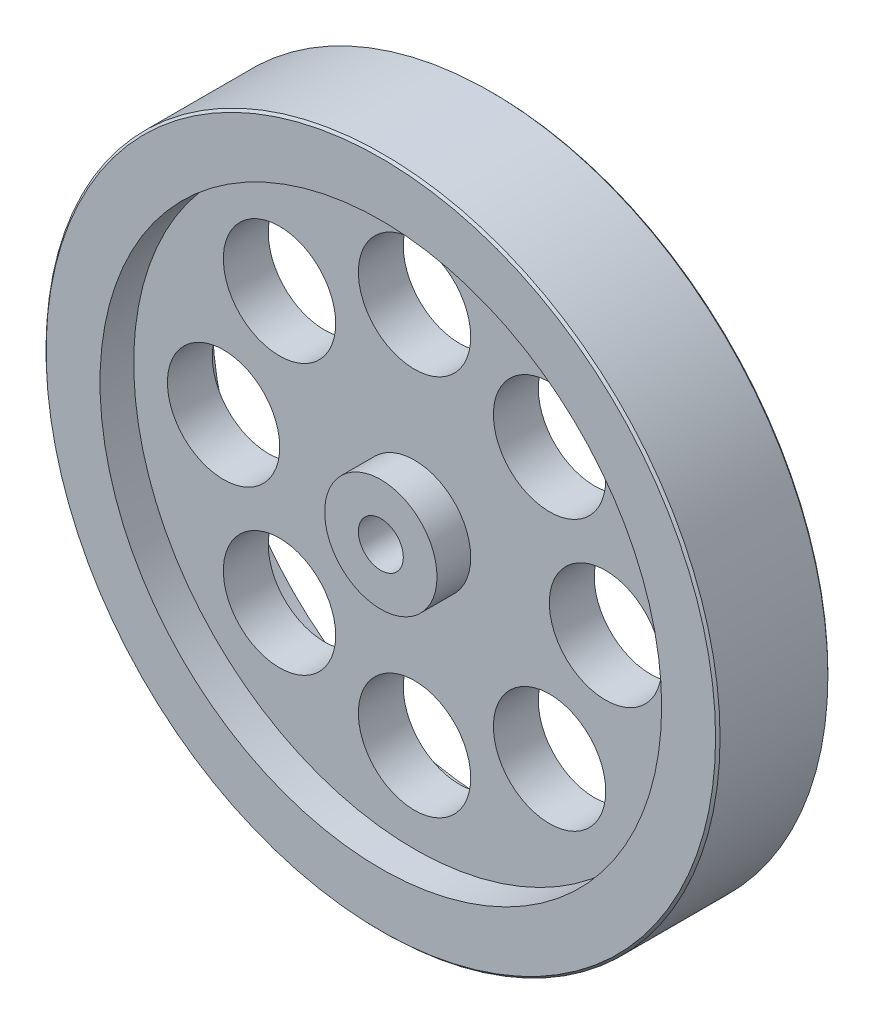
ISO-10303-21;
HEADER;
FILE_DESCRIPTION(('STEP AP214'),'2;1');
FILE_NAME('part.step','',(''),(''),'','','');
FILE_SCHEMA(('AUTOMOTIVE_DESIGN { 1 0 10303 214 1 1 1 1 }'));
ENDSEC;
DATA;
#1=APPLICATION_CONTEXT('core data for automotive mechanical design processes');
#2=APPLICATION_PROTOCOL_DEFINITION('international standard','automotive_design',2000,#1);
#3=PRODUCT_CONTEXT('',#1,'mechanical');
#4=PRODUCT('Part','Part','',(#3));
#5=PRODUCT_RELATED_PRODUCT_CATEGORY('part','',(#4));
#6=PRODUCT_DEFINITION_FORMATION('','',#4);
#7=PRODUCT_DEFINITION_CONTEXT('part definition',#1,'design');
#8=PRODUCT_DEFINITION('design','',#6,#7);
#9=PRODUCT_DEFINITION_SHAPE('','',#8);
#10=(LENGTH_UNIT() NAMED_UNIT(*) SI_UNIT(.MILLI.,.METRE.));
#11=(NAMED_UNIT(*) PLANE_ANGLE_UNIT() SI_UNIT($,.RADIAN.));
#12=(NAMED_UNIT(*) SI_UNIT($,.STERADIAN.) SOLID_ANGLE_UNIT());
#13=UNCERTAINTY_MEASURE_WITH_UNIT(LENGTH_MEASURE(1.E-05),#10,'distance_accuracy_value','');
#14=(GEOMETRIC_REPRESENTATION_CONTEXT(3) GLOBAL_UNCERTAINTY_ASSIGNED_CONTEXT((#13)) GLOBAL_UNIT_ASSIGNED_CONTEXT((#10,
#11,#12)) REPRESENTATION_CONTEXT('',''));
#15=CARTESIAN_POINT('',(0.,0.,0.));
#16=DIRECTION('',(0.,0.,1.));
#17=DIRECTION('',(1.,0.,0.));
#18=AXIS2_PLACEMENT_3D('',#15,#16,#17);
#19=CARTESIAN_POINT('',(0.,0.,5.));
#20=DIRECTION('',(0.,0.,-1.));
#21=DIRECTION('',(-1.,0.,0.));
#22=AXIS2_PLACEMENT_3D('',#19,#20,#21);
#23=CYLINDRICAL_SURFACE('',#22,30.);
#24=CARTESIAN_POINT('',(0.,0.,4.80000000000003));
#25=DIRECTION('',(0.,0.,1.));
#26=DIRECTION('',(1.,0.,0.));
#27=AXIS2_PLACEMENT_3D('',#24,#25,#26);
#28=CIRCLE('',#27,30.);
#29=CARTESIAN_POINT('',(30.,0.,4.80000000000003));
#30=VERTEX_POINT('',#29);
#31=EDGE_CURVE('E43',#30,#30,#28,.F.);
#32=ORIENTED_EDGE('',*,*,#31,.T.);
#33=EDGE_LOOP('',(#32));
#34=FACE_BOUND('',#33,.T.);
#35=CARTESIAN_POINT('',(0.,0.,-4.80000000000001));
#36=DIRECTION('',(0.,0.,1.));
#37=DIRECTION('',(1.,0.,0.));
#38=AXIS2_PLACEMENT_3D('',#35,#36,#37);
#39=CIRCLE('',#38,30.);
#40=CARTESIAN_POINT('',(30.,0.,-4.80000000000001));
#41=VERTEX_POINT('',#40);
#42=EDGE_CURVE('E47',#41,#41,#39,.T.);
#43=ORIENTED_EDGE('',*,*,#42,.T.);
#44=EDGE_LOOP('',(#43));
#45=FACE_BOUND('',#44,.T.);
#46=ADVANCED_FACE('F35',(#34,#45),#23,.T.);
#47=CARTESIAN_POINT('',(0.,0.,5.));
#48=DIRECTION('',(0.,0.,1.));
#49=DIRECTION('',(1.,0.,0.));
#50=AXIS2_PLACEMENT_3D('',#47,#48,#49);
#51=PLANE('',#50);
#52=CARTESIAN_POINT('',(0.,0.,5.));
#53=DIRECTION('',(0.,0.,1.));
#54=DIRECTION('',(1.,0.,0.));
#55=AXIS2_PLACEMENT_3D('',#52,#53,#54);
#56=CIRCLE('',#55,29.8);
#57=CARTESIAN_POINT('',(29.8,0.,5.));
#58=VERTEX_POINT('',#57);
#59=EDGE_CURVE('E51',#58,#58,#56,.T.);
#60=ORIENTED_EDGE('',*,*,#59,.T.);
#61=EDGE_LOOP('',(#60));
#62=FACE_BOUND('',#61,.T.);
#63=CARTESIAN_POINT('',(0.,0.,5.));
#64=DIRECTION('',(0.,0.,1.));
#65=DIRECTION('',(1.,0.,0.));
#66=AXIS2_PLACEMENT_3D('',#63,#64,#65);
#67=CIRCLE('',#66,25.);
#68=CARTESIAN_POINT('',(25.,0.,5.));
#69=VERTEX_POINT('',#68);
#70=EDGE_CURVE('E93',#69,#69,#67,.T.);
#71=ORIENTED_EDGE('',*,*,#70,.F.);
#72=EDGE_LOOP('',(#71));
#73=FACE_BOUND('',#72,.T.);
#74=ADVANCED_FACE('F191',(#62,#73),#51,.T.);
#75=CARTESIAN_POINT('',(0.,0.,-5.));
#76=DIRECTION('',(0.,0.,1.));
#77=DIRECTION('',(1.,0.,0.));
#78=AXIS2_PLACEMENT_3D('',#75,#76,#77);
#79=PLANE('',#78);
#80=CARTESIAN_POINT('',(0.,0.,-5.));
#81=DIRECTION('',(0.,0.,1.));
#82=DIRECTION('',(1.,0.,0.));
#83=AXIS2_PLACEMENT_3D('',#80,#81,#82);
#84=CIRCLE('',#83,29.8);
#85=CARTESIAN_POINT('',(29.8,0.,-5.));
#86=VERTEX_POINT('',#85);
#87=EDGE_CURVE('E10',#86,#86,#84,.F.);
#88=ORIENTED_EDGE('',*,*,#87,.T.);
#89=EDGE_LOOP('',(#88));
#90=FACE_BOUND('',#89,.T.);
#91=CARTESIAN_POINT('',(0.,0.,-5.));
#92=DIRECTION('',(0.,0.,1.));
#93=DIRECTION('',(1.,0.,0.));
#94=AXIS2_PLACEMENT_3D('',#91,#92,#93);
#95=CIRCLE('',#94,25.);
#96=CARTESIAN_POINT('',(25.,0.,-5.));
#97=VERTEX_POINT('',#96);
#98=EDGE_CURVE('E99',#97,#97,#95,.T.);
#99=ORIENTED_EDGE('',*,*,#98,.T.);
#100=EDGE_LOOP('',(#99));
#101=FACE_BOUND('',#100,.T.);
#102=ADVANCED_FACE('F187',(#90,#101),#79,.F.);
#103=CARTESIAN_POINT('',(0.,0.,2.));
#104=DIRECTION('',(0.,0.,1.));
#105=DIRECTION('',(1.,0.,0.));
#106=AXIS2_PLACEMENT_3D('',#103,#104,#105);
#107=CYLINDRICAL_SURFACE('',#106,25.);
#108=CARTESIAN_POINT('',(0.,0.,2.));
#109=DIRECTION('',(0.,0.,1.));
#110=DIRECTION('',(1.,0.,0.));
#111=AXIS2_PLACEMENT_3D('',#108,#109,#110);
#112=CIRCLE('',#111,25.);
#113=CARTESIAN_POINT('',(25.,0.,2.));
#114=VERTEX_POINT('',#113);
#115=EDGE_CURVE('E59',#114,#114,#112,.T.);
#116=ORIENTED_EDGE('',*,*,#115,.F.);
#117=EDGE_LOOP('',(#116));
#118=FACE_BOUND('',#117,.T.);
#119=ORIENTED_EDGE('',*,*,#70,.T.);
#120=EDGE_LOOP('',(#119));
#121=FACE_BOUND('',#120,.T.);
#122=ADVANCED_FACE('F165',(#118,#121),#107,.F.);
#123=CARTESIAN_POINT('',(0.,0.,2.));
#124=DIRECTION('',(0.,0.,1.));
#125=DIRECTION('',(1.,0.,0.));
#126=AXIS2_PLACEMENT_3D('',#123,#124,#125);
#127=PLANE('',#126);
#128=CARTESIAN_POINT('',(0.,0.,2.));
#129=DIRECTION('',(0.,0.,1.));
#130=DIRECTION('',(1.,0.,0.));
#131=AXIS2_PLACEMENT_3D('',#128,#129,#130);
#132=CIRCLE('',#131,5.);
#133=CARTESIAN_POINT('',(5.,0.,2.));
#134=VERTEX_POINT('',#133);
#135=EDGE_CURVE('E120',#134,#134,#132,.T.);
#136=ORIENTED_EDGE('',*,*,#135,.F.);
#137=EDGE_LOOP('',(#136));
#138=FACE_BOUND('',#137,.T.);
#139=CARTESIAN_POINT('',(-12.0208152801711,12.0208152801708,2.));
#140=DIRECTION('',(0.,0.,1.));
#141=DIRECTION('',(1.,0.,0.));
#142=AXIS2_PLACEMENT_3D('',#139,#140,#141);
#143=CIRCLE('',#142,5.00000000000056);
#144=CARTESIAN_POINT('',(-7.02081528017055,12.0208152801708,2.));
#145=VERTEX_POINT('',#144);
#146=EDGE_CURVE('E63',#145,#145,#143,.T.);
#147=ORIENTED_EDGE('',*,*,#146,.F.);
#148=EDGE_LOOP('',(#147));
#149=FACE_BOUND('',#148,.T.);
#150=CARTESIAN_POINT('',(-16.9999999999993,-7.23712640696027E-13,2.));
#151=DIRECTION('',(0.,0.,1.));
#152=DIRECTION('',(1.,0.,0.));
#153=AXIS2_PLACEMENT_3D('',#150,#151,#152);
#154=CIRCLE('',#153,5.00000000000107);
#155=CARTESIAN_POINT('',(-11.9999999999982,-7.23712640696027E-13,2.));
#156=VERTEX_POINT('',#155);
#157=EDGE_CURVE('E64',#156,#156,#154,.T.);
#158=ORIENTED_EDGE('',*,*,#157,.F.);
#159=EDGE_LOOP('',(#158));
#160=FACE_BOUND('',#159,.T.);
#161=CARTESIAN_POINT('',(-12.0208152801701,-12.0208152801718,2.));
#162=DIRECTION('',(0.,0.,1.));
#163=DIRECTION('',(1.,0.,0.));
#164=AXIS2_PLACEMENT_3D('',#161,#162,#163);
#165=CIRCLE('',#164,5.00000000000147);
#166=CARTESIAN_POINT('',(-7.02081528016861,-12.0208152801718,2.));
#167=VERTEX_POINT('',#166);
#168=EDGE_CURVE('E68',#167,#167,#165,.T.);
#169=ORIENTED_EDGE('',*,*,#168,.F.);
#170=EDGE_LOOP('',(#169));
#171=FACE_BOUND('',#170,.T.);
#172=CARTESIAN_POINT('',(1.44326148227495E-12,-17.,2.));
#173=DIRECTION('',(0.,0.,1.));
#174=DIRECTION('',(1.,0.,0.));
#175=AXIS2_PLACEMENT_3D('',#172,#173,#174);
#176=CIRCLE('',#175,5.0000000000015);
#177=CARTESIAN_POINT('',(5.00000000000294,-17.,2.));
#178=VERTEX_POINT('',#177);
#179=EDGE_CURVE('E72',#178,#178,#176,.T.);
#180=ORIENTED_EDGE('',*,*,#179,.F.);
#181=EDGE_LOOP('',(#180));
#182=FACE_BOUND('',#181,.T.);
#183=CARTESIAN_POINT('',(12.0208152801725,-12.0208152801708,2.));
#184=DIRECTION('',(0.,0.,1.));
#185=DIRECTION('',(1.,0.,0.));
#186=AXIS2_PLACEMENT_3D('',#183,#184,#185);
#187=CIRCLE('',#186,5.00000000000111);
#188=CARTESIAN_POINT('',(17.0208152801737,-12.0208152801708,2.));
#189=VERTEX_POINT('',#188);
#190=EDGE_CURVE('E76',#189,#189,#187,.T.);
#191=ORIENTED_EDGE('',*,*,#190,.F.);
#192=EDGE_LOOP('',(#191));
#193=FACE_BOUND('',#192,.T.);
#194=CARTESIAN_POINT('',(17.0000000000007,7.21630741137477E-13,2.));
#195=DIRECTION('',(0.,0.,1.));
#196=DIRECTION('',(1.,0.,0.));
#197=AXIS2_PLACEMENT_3D('',#194,#195,#196);
#198=CIRCLE('',#197,5.00000000000054);
#199=CARTESIAN_POINT('',(22.0000000000013,7.21630741137477E-13,2.));
#200=VERTEX_POINT('',#199);
#201=EDGE_CURVE('E80',#200,#200,#198,.T.);
#202=ORIENTED_EDGE('',*,*,#201,.F.);
#203=EDGE_LOOP('',(#202));
#204=FACE_BOUND('',#203,.T.);
#205=CARTESIAN_POINT('',(12.0208152801715,12.0208152801718,2.));
#206=DIRECTION('',(0.,0.,1.));
#207=DIRECTION('',(1.,0.,0.));
#208=AXIS2_PLACEMENT_3D('',#205,#206,#207);
#209=CIRCLE('',#208,5.00000000000009);
#210=CARTESIAN_POINT('',(17.0208152801716,12.0208152801718,2.));
#211=VERTEX_POINT('',#210);
#212=EDGE_CURVE('E84',#211,#211,#209,.T.);
#213=ORIENTED_EDGE('',*,*,#212,.F.);
#214=EDGE_LOOP('',(#213));
#215=FACE_BOUND('',#214,.T.);
#216=CARTESIAN_POINT('',(0.,17.,2.));
#217=DIRECTION('',(0.,0.,1.));
#218=DIRECTION('',(1.,0.,0.));
#219=AXIS2_PLACEMENT_3D('',#216,#217,#218);
#220=CIRCLE('',#219,5.);
#221=CARTESIAN_POINT('',(5.,17.,2.));
#222=VERTEX_POINT('',#221);
#223=EDGE_CURVE('E88',#222,#222,#220,.T.);
#224=ORIENTED_EDGE('',*,*,#223,.F.);
#225=EDGE_LOOP('',(#224));
#226=FACE_BOUND('',#225,.T.);
#227=ORIENTED_EDGE('',*,*,#115,.T.);
#228=EDGE_LOOP('',(#227));
#229=FACE_BOUND('',#228,.T.);
#230=ADVANCED_FACE('F161',(#138,#149,#160,#171,#182,#193,#204,#215,#226,#229),#127,.T.);
#231=CARTESIAN_POINT('',(0.,0.,-2.));
#232=DIRECTION('',(0.,0.,-1.));
#233=DIRECTION('',(-1.,0.,0.));
#234=AXIS2_PLACEMENT_3D('',#231,#232,#233);
#235=CYLINDRICAL_SURFACE('',#234,25.);
#236=CARTESIAN_POINT('',(0.,0.,-2.));
#237=DIRECTION('',(0.,0.,1.));
#238=DIRECTION('',(1.,0.,0.));
#239=AXIS2_PLACEMENT_3D('',#236,#237,#238);
#240=CIRCLE('',#239,25.);
#241=CARTESIAN_POINT('',(25.,0.,-2.));
#242=VERTEX_POINT('',#241);
#243=EDGE_CURVE('E96',#242,#242,#240,.T.);
#244=ORIENTED_EDGE('',*,*,#243,.T.);
#245=EDGE_LOOP('',(#244));
#246=FACE_BOUND('',#245,.T.);
#247=ORIENTED_EDGE('',*,*,#98,.F.);
#248=EDGE_LOOP('',(#247));
#249=FACE_BOUND('',#248,.T.);
#250=ADVANCED_FACE('F164',(#246,#249),#235,.F.);
#251=CARTESIAN_POINT('',(0.,0.,-2.));
#252=DIRECTION('',(0.,0.,-1.));
#253=DIRECTION('',(1.,0.,0.));
#254=AXIS2_PLACEMENT_3D('',#251,#252,#253);
#255=PLANE('',#254);
#256=CARTESIAN_POINT('',(0.,0.,-2.));
#257=DIRECTION('',(0.,0.,-1.));
#258=DIRECTION('',(-1.,0.,0.));
#259=AXIS2_PLACEMENT_3D('',#256,#257,#258);
#260=CIRCLE('',#259,5.);
#261=CARTESIAN_POINT('',(-5.,0.,-2.));
#262=VERTEX_POINT('',#261);
#263=EDGE_CURVE('E56',#262,#262,#260,.T.);
#264=ORIENTED_EDGE('',*,*,#263,.F.);
#265=EDGE_LOOP('',(#264));
#266=FACE_BOUND('',#265,.T.);
#267=CARTESIAN_POINT('',(-12.0208152801711,12.0208152801708,-2.));
#268=DIRECTION('',(0.,0.,-1.));
#269=DIRECTION('',(-1.,0.,0.));
#270=AXIS2_PLACEMENT_3D('',#267,#268,#269);
#271=CIRCLE('',#270,5.00000000000056);
#272=CARTESIAN_POINT('',(-17.0208152801717,12.0208152801708,-2.));
#273=VERTEX_POINT('',#272);
#274=EDGE_CURVE('E60',#273,#273,#271,.T.);
#275=ORIENTED_EDGE('',*,*,#274,.F.);
#276=EDGE_LOOP('',(#275));
#277=FACE_BOUND('',#276,.T.);
#278=CARTESIAN_POINT('',(-16.9999999999993,-7.23712640696027E-13,-2.));
#279=DIRECTION('',(0.,0.,-1.));
#280=DIRECTION('',(-1.,0.,0.));
#281=AXIS2_PLACEMENT_3D('',#278,#279,#280);
#282=CIRCLE('',#281,5.00000000000107);
#283=CARTESIAN_POINT('',(-22.0000000000004,-7.23712640696027E-13,-2.));
#284=VERTEX_POINT('',#283);
#285=EDGE_CURVE('E65',#284,#284,#282,.T.);
#286=ORIENTED_EDGE('',*,*,#285,.F.);
#287=EDGE_LOOP('',(#286));
#288=FACE_BOUND('',#287,.T.);
#289=CARTESIAN_POINT('',(-12.0208152801701,-12.0208152801718,-2.));
#290=DIRECTION('',(0.,0.,-1.));
#291=DIRECTION('',(-1.,0.,0.));
#292=AXIS2_PLACEMENT_3D('',#289,#290,#291);
#293=CIRCLE('',#292,5.00000000000147);
#294=CARTESIAN_POINT('',(-17.0208152801715,-12.0208152801718,-2.));
#295=VERTEX_POINT('',#294);
#296=EDGE_CURVE('E69',#295,#295,#293,.T.);
#297=ORIENTED_EDGE('',*,*,#296,.F.);
#298=EDGE_LOOP('',(#297));
#299=FACE_BOUND('',#298,.T.);
#300=CARTESIAN_POINT('',(1.44326148227495E-12,-17.,-2.));
#301=DIRECTION('',(0.,0.,-1.));
#302=DIRECTION('',(-1.,0.,0.));
#303=AXIS2_PLACEMENT_3D('',#300,#301,#302);
#304=CIRCLE('',#303,5.0000000000015);
#305=CARTESIAN_POINT('',(-5.00000000000005,-17.,-2.));
#306=VERTEX_POINT('',#305);
#307=EDGE_CURVE('E73',#306,#306,#304,.T.);
#308=ORIENTED_EDGE('',*,*,#307,.F.);
#309=EDGE_LOOP('',(#308));
#310=FACE_BOUND('',#309,.T.);
#311=CARTESIAN_POINT('',(12.0208152801725,-12.0208152801708,-2.));
#312=DIRECTION('',(0.,0.,-1.));
#313=DIRECTION('',(-1.,0.,0.));
#314=AXIS2_PLACEMENT_3D('',#311,#312,#313);
#315=CIRCLE('',#314,5.00000000000111);
#316=CARTESIAN_POINT('',(7.02081528017143,-12.0208152801708,-2.));
#317=VERTEX_POINT('',#316);
#318=EDGE_CURVE('E77',#317,#317,#315,.T.);
#319=ORIENTED_EDGE('',*,*,#318,.F.);
#320=EDGE_LOOP('',(#319));
#321=FACE_BOUND('',#320,.T.);
#322=CARTESIAN_POINT('',(17.0000000000007,7.21630741137477E-13,-2.));
#323=DIRECTION('',(0.,0.,-1.));
#324=DIRECTION('',(-1.,0.,0.));
#325=AXIS2_PLACEMENT_3D('',#322,#323,#324);
#326=CIRCLE('',#325,5.00000000000054);
#327=CARTESIAN_POINT('',(12.0000000000002,7.21630741137477E-13,-2.));
#328=VERTEX_POINT('',#327);
#329=EDGE_CURVE('E81',#328,#328,#326,.T.);
#330=ORIENTED_EDGE('',*,*,#329,.F.);
#331=EDGE_LOOP('',(#330));
#332=FACE_BOUND('',#331,.T.);
#333=CARTESIAN_POINT('',(12.0208152801715,12.0208152801718,-2.));
#334=DIRECTION('',(0.,0.,-1.));
#335=DIRECTION('',(-1.,0.,0.));
#336=AXIS2_PLACEMENT_3D('',#333,#334,#335);
#337=CIRCLE('',#336,5.00000000000009);
#338=CARTESIAN_POINT('',(7.02081528017143,12.0208152801718,-2.));
#339=VERTEX_POINT('',#338);
#340=EDGE_CURVE('E85',#339,#339,#337,.T.);
#341=ORIENTED_EDGE('',*,*,#340,.F.);
#342=EDGE_LOOP('',(#341));
#343=FACE_BOUND('',#342,.T.);
#344=CARTESIAN_POINT('',(0.,17.,-2.));
#345=DIRECTION('',(0.,0.,-1.));
#346=DIRECTION('',(-1.,0.,0.));
#347=AXIS2_PLACEMENT_3D('',#344,#345,#346);
#348=CIRCLE('',#347,5.);
#349=CARTESIAN_POINT('',(-5.,17.,-2.));
#350=VERTEX_POINT('',#349);
#351=EDGE_CURVE('E89',#350,#350,#348,.T.);
#352=ORIENTED_EDGE('',*,*,#351,.F.);
#353=EDGE_LOOP('',(#352));
#354=FACE_BOUND('',#353,.T.);
#355=ORIENTED_EDGE('',*,*,#243,.F.);
#356=EDGE_LOOP('',(#355));
#357=FACE_BOUND('',#356,.T.);
#358=ADVANCED_FACE('F267',(#266,#277,#288,#299,#310,#321,#332,#343,#354,#357),#255,.T.);
#359=CARTESIAN_POINT('',(0.,17.,-5.));
#360=DIRECTION('',(0.,0.,1.));
#361=DIRECTION('',(1.,0.,0.));
#362=AXIS2_PLACEMENT_3D('',#359,#360,#361);
#363=CYLINDRICAL_SURFACE('',#362,5.);
#364=ORIENTED_EDGE('',*,*,#223,.T.);
#365=EDGE_LOOP('',(#364));
#366=FACE_BOUND('',#365,.T.);
#367=ORIENTED_EDGE('',*,*,#351,.T.);
#368=EDGE_LOOP('',(#367));
#369=FACE_BOUND('',#368,.T.);
#370=ADVANCED_FACE('F241',(#366,#369),#363,.F.);
#371=CARTESIAN_POINT('',(12.0208152801715,12.0208152801718,-5.));
#372=DIRECTION('',(0.,0.,1.));
#373=DIRECTION('',(1.,0.,0.));
#374=AXIS2_PLACEMENT_3D('',#371,#372,#373);
#375=CYLINDRICAL_SURFACE('',#374,5.00000000000009);
#376=ORIENTED_EDGE('',*,*,#212,.T.);
#377=EDGE_LOOP('',(#376));
#378=FACE_BOUND('',#377,.T.);
#379=ORIENTED_EDGE('',*,*,#340,.T.);
#380=EDGE_LOOP('',(#379));
#381=FACE_BOUND('',#380,.T.);
#382=ADVANCED_FACE('F237',(#378,#381),#375,.F.);
#383=CARTESIAN_POINT('',(17.0000000000007,7.21630741137477E-13,-5.));
#384=DIRECTION('',(0.,0.,1.));
#385=DIRECTION('',(1.,0.,0.));
#386=AXIS2_PLACEMENT_3D('',#383,#384,#385);
#387=CYLINDRICAL_SURFACE('',#386,5.00000000000054);
#388=ORIENTED_EDGE('',*,*,#201,.T.);
#389=EDGE_LOOP('',(#388));
#390=FACE_BOUND('',#389,.T.);
#391=ORIENTED_EDGE('',*,*,#329,.T.);
#392=EDGE_LOOP('',(#391));
#393=FACE_BOUND('',#392,.T.);
#394=ADVANCED_FACE('F240',(#390,#393),#387,.F.);
#395=CARTESIAN_POINT('',(12.0208152801725,-12.0208152801708,-5.));
#396=DIRECTION('',(0.,0.,1.));
#397=DIRECTION('',(1.,0.,0.));
#398=AXIS2_PLACEMENT_3D('',#395,#396,#397);
#399=CYLINDRICAL_SURFACE('',#398,5.00000000000111);
#400=ORIENTED_EDGE('',*,*,#190,.T.);
#401=EDGE_LOOP('',(#400));
#402=FACE_BOUND('',#401,.T.);
#403=ORIENTED_EDGE('',*,*,#318,.T.);
#404=EDGE_LOOP('',(#403));
#405=FACE_BOUND('',#404,.T.);
#406=ADVANCED_FACE('F245',(#402,#405),#399,.F.);
#407=CARTESIAN_POINT('',(1.44326148227495E-12,-17.,-5.));
#408=DIRECTION('',(0.,0.,1.));
#409=DIRECTION('',(1.,0.,0.));
#410=AXIS2_PLACEMENT_3D('',#407,#408,#409);
#411=CYLINDRICAL_SURFACE('',#410,5.0000000000015);
#412=ORIENTED_EDGE('',*,*,#179,.T.);
#413=EDGE_LOOP('',(#412));
#414=FACE_BOUND('',#413,.T.);
#415=ORIENTED_EDGE('',*,*,#307,.T.);
#416=EDGE_LOOP('',(#415));
#417=FACE_BOUND('',#416,.T.);
#418=ADVANCED_FACE('F249',(#414,#417),#411,.F.);
#419=CARTESIAN_POINT('',(-12.0208152801701,-12.0208152801718,-5.));
#420=DIRECTION('',(0.,0.,1.));
#421=DIRECTION('',(1.,0.,0.));
#422=AXIS2_PLACEMENT_3D('',#419,#420,#421);
#423=CYLINDRICAL_SURFACE('',#422,5.00000000000147);
#424=ORIENTED_EDGE('',*,*,#168,.T.);
#425=EDGE_LOOP('',(#424));
#426=FACE_BOUND('',#425,.T.);
#427=ORIENTED_EDGE('',*,*,#296,.T.);
#428=EDGE_LOOP('',(#427));
#429=FACE_BOUND('',#428,.T.);
#430=ADVANCED_FACE('F253',(#426,#429),#423,.F.);
#431=CARTESIAN_POINT('',(-16.9999999999993,-7.23712640696027E-13,-5.));
#432=DIRECTION('',(0.,0.,1.));
#433=DIRECTION('',(1.,0.,0.));
#434=AXIS2_PLACEMENT_3D('',#431,#432,#433);
#435=CYLINDRICAL_SURFACE('',#434,5.00000000000107);
#436=ORIENTED_EDGE('',*,*,#157,.T.);
#437=EDGE_LOOP('',(#436));
#438=FACE_BOUND('',#437,.T.);
#439=ORIENTED_EDGE('',*,*,#285,.T.);
#440=EDGE_LOOP('',(#439));
#441=FACE_BOUND('',#440,.T.);
#442=ADVANCED_FACE('F257',(#438,#441),#435,.F.);
#443=CARTESIAN_POINT('',(-12.0208152801711,12.0208152801708,-5.));
#444=DIRECTION('',(0.,0.,1.));
#445=DIRECTION('',(1.,0.,0.));
#446=AXIS2_PLACEMENT_3D('',#443,#444,#445);
#447=CYLINDRICAL_SURFACE('',#446,5.00000000000056);
#448=ORIENTED_EDGE('',*,*,#146,.T.);
#449=EDGE_LOOP('',(#448));
#450=FACE_BOUND('',#449,.T.);
#451=ORIENTED_EDGE('',*,*,#274,.T.);
#452=EDGE_LOOP('',(#451));
#453=FACE_BOUND('',#452,.T.);
#454=ADVANCED_FACE('F157',(#450,#453),#447,.F.);
#455=CARTESIAN_POINT('',(0.,0.,5.));
#456=DIRECTION('',(0.,0.,-1.));
#457=DIRECTION('',(-1.,0.,0.));
#458=AXIS2_PLACEMENT_3D('',#455,#456,#457);
#459=CYLINDRICAL_SURFACE('',#458,5.);
#460=CARTESIAN_POINT('',(0.,0.,5.));
#461=DIRECTION('',(0.,0.,1.));
#462=DIRECTION('',(1.,0.,0.));
#463=AXIS2_PLACEMENT_3D('',#460,#461,#462);
#464=CIRCLE('',#463,5.);
#465=CARTESIAN_POINT('',(5.,0.,5.));
#466=VERTEX_POINT('',#465);
#467=EDGE_CURVE('E92',#466,#466,#464,.T.);
#468=ORIENTED_EDGE('',*,*,#467,.F.);
#469=EDGE_LOOP('',(#468));
#470=FACE_BOUND('',#469,.T.);
#471=ORIENTED_EDGE('',*,*,#135,.T.);
#472=EDGE_LOOP('',(#471));
#473=FACE_BOUND('',#472,.T.);
#474=ADVANCED_FACE('F151',(#470,#473),#459,.T.);
#475=CARTESIAN_POINT('',(0.,0.,5.));
#476=DIRECTION('',(0.,0.,1.));
#477=DIRECTION('',(1.,0.,0.));
#478=AXIS2_PLACEMENT_3D('',#475,#476,#477);
#479=PLANE('',#478);
#480=CARTESIAN_POINT('',(0.,0.,5.));
#481=DIRECTION('',(0.,0.,1.));
#482=DIRECTION('',(1.,0.,0.));
#483=AXIS2_PLACEMENT_3D('',#480,#481,#482);
#484=CIRCLE('',#483,2.);
#485=CARTESIAN_POINT('',(2.,0.,5.));
#486=VERTEX_POINT('',#485);
#487=EDGE_CURVE('E140',#486,#486,#484,.T.);
#488=ORIENTED_EDGE('',*,*,#487,.F.);
#489=EDGE_LOOP('',(#488));
#490=FACE_BOUND('',#489,.T.);
#491=ORIENTED_EDGE('',*,*,#467,.T.);
#492=EDGE_LOOP('',(#491));
#493=FACE_BOUND('',#492,.T.);
#494=ADVANCED_FACE('F147',(#490,#493),#479,.T.);
#495=CARTESIAN_POINT('',(0.,0.,-5.));
#496=DIRECTION('',(0.,0.,1.));
#497=DIRECTION('',(1.,0.,0.));
#498=AXIS2_PLACEMENT_3D('',#495,#496,#497);
#499=CYLINDRICAL_SURFACE('',#498,5.);
#500=CARTESIAN_POINT('',(0.,0.,-5.));
#501=DIRECTION('',(0.,0.,1.));
#502=DIRECTION('',(1.,0.,0.));
#503=AXIS2_PLACEMENT_3D('',#500,#501,#502);
#504=CIRCLE('',#503,5.);
#505=CARTESIAN_POINT('',(5.,0.,-5.));
#506=VERTEX_POINT('',#505);
#507=EDGE_CURVE('E123',#506,#506,#504,.T.);
#508=ORIENTED_EDGE('',*,*,#507,.T.);
#509=EDGE_LOOP('',(#508));
#510=FACE_BOUND('',#509,.T.);
#511=ORIENTED_EDGE('',*,*,#263,.T.);
#512=EDGE_LOOP('',(#511));
#513=FACE_BOUND('',#512,.T.);
#514=ADVANCED_FACE('F150',(#510,#513),#499,.T.);
#515=CARTESIAN_POINT('',(0.,0.,-5.));
#516=DIRECTION('',(0.,0.,-1.));
#517=DIRECTION('',(1.,0.,0.));
#518=AXIS2_PLACEMENT_3D('',#515,#516,#517);
#519=PLANE('',#518);
#520=CARTESIAN_POINT('',(0.,0.,-5.));
#521=DIRECTION('',(0.,0.,1.));
#522=DIRECTION('',(1.,0.,0.));
#523=AXIS2_PLACEMENT_3D('',#520,#521,#522);
#524=CIRCLE('',#523,2.99999999999999);
#525=CARTESIAN_POINT('',(2.99999999999999,0.,-5.));
#526=VERTEX_POINT('',#525);
#527=EDGE_CURVE('E128',#526,#526,#524,.T.);
#528=ORIENTED_EDGE('',*,*,#527,.T.);
#529=EDGE_LOOP('',(#528));
#530=FACE_BOUND('',#529,.T.);
#531=ORIENTED_EDGE('',*,*,#507,.F.);
#532=EDGE_LOOP('',(#531));
#533=FACE_BOUND('',#532,.T.);
#534=ADVANCED_FACE('F229',(#530,#533),#519,.T.);
#535=CARTESIAN_POINT('',(0.,0.,-5.));
#536=DIRECTION('',(0.,0.,-1.));
#537=DIRECTION('',(-1.,0.,0.));
#538=AXIS2_PLACEMENT_3D('',#535,#536,#537);
#539=CONICAL_SURFACE('',#538,2.99999999999999,0.785398163397443);
#540=CARTESIAN_POINT('',(0.,0.,-3.5));
#541=DIRECTION('',(0.,0.,1.));
#542=DIRECTION('',(1.,0.,0.));
#543=AXIS2_PLACEMENT_3D('',#540,#541,#542);
#544=CIRCLE('',#543,1.5);
#545=CARTESIAN_POINT('',(1.5,0.,-3.5));
#546=VERTEX_POINT('',#545);
#547=EDGE_CURVE('E131',#546,#546,#544,.T.);
#548=ORIENTED_EDGE('',*,*,#547,.T.);
#549=EDGE_LOOP('',(#548));
#550=FACE_BOUND('',#549,.T.);
#551=ORIENTED_EDGE('',*,*,#527,.F.);
#552=EDGE_LOOP('',(#551));
#553=FACE_BOUND('',#552,.T.);
#554=ADVANCED_FACE('F225',(#550,#553),#539,.F.);
#555=CARTESIAN_POINT('',(0.,0.,5.));
#556=DIRECTION('',(0.,0.,1.));
#557=DIRECTION('',(1.,0.,0.));
#558=AXIS2_PLACEMENT_3D('',#555,#556,#557);
#559=CYLINDRICAL_SURFACE('',#558,1.5);
#560=CARTESIAN_POINT('',(0.,0.,-0.999999999999997));
#561=DIRECTION('',(0.,0.,1.));
#562=DIRECTION('',(1.,0.,0.));
#563=AXIS2_PLACEMENT_3D('',#560,#561,#562);
#564=CIRCLE('',#563,1.5);
#565=CARTESIAN_POINT('',(1.5,0.,-0.999999999999997));
#566=VERTEX_POINT('',#565);
#567=EDGE_CURVE('E134',#566,#566,#564,.T.);
#568=ORIENTED_EDGE('',*,*,#567,.T.);
#569=EDGE_LOOP('',(#568));
#570=FACE_BOUND('',#569,.T.);
#571=ORIENTED_EDGE('',*,*,#547,.F.);
#572=EDGE_LOOP('',(#571));
#573=FACE_BOUND('',#572,.T.);
#574=ADVANCED_FACE('F219',(#570,#573),#559,.F.);
#575=CARTESIAN_POINT('',(0.,1.5,-0.999999999999997));
#576=DIRECTION('',(0.,0.,1.));
#577=DIRECTION('',(1.,0.,0.));
#578=AXIS2_PLACEMENT_3D('',#575,#576,#577);
#579=PLANE('',#578);
#580=CARTESIAN_POINT('',(0.,0.,-0.999999999999997));
#581=DIRECTION('',(0.,0.,1.));
#582=DIRECTION('',(1.,0.,0.));
#583=AXIS2_PLACEMENT_3D('',#580,#581,#582);
#584=CIRCLE('',#583,2.);
#585=CARTESIAN_POINT('',(2.,0.,-0.999999999999997));
#586=VERTEX_POINT('',#585);
#587=EDGE_CURVE('E137',#586,#586,#584,.T.);
#588=ORIENTED_EDGE('',*,*,#587,.T.);
#589=EDGE_LOOP('',(#588));
#590=FACE_BOUND('',#589,.T.);
#591=ORIENTED_EDGE('',*,*,#567,.F.);
#592=EDGE_LOOP('',(#591));
#593=FACE_BOUND('',#592,.T.);
#594=ADVANCED_FACE('F212',(#590,#593),#579,.T.);
#595=CARTESIAN_POINT('',(0.,0.,5.));
#596=DIRECTION('',(0.,0.,1.));
#597=DIRECTION('',(1.,0.,0.));
#598=AXIS2_PLACEMENT_3D('',#595,#596,#597);
#599=CYLINDRICAL_SURFACE('',#598,2.);
#600=ORIENTED_EDGE('',*,*,#487,.T.);
#601=EDGE_LOOP('',(#600));
#602=FACE_BOUND('',#601,.T.);
#603=ORIENTED_EDGE('',*,*,#587,.F.);
#604=EDGE_LOOP('',(#603));
#605=FACE_BOUND('',#604,.T.);
#606=ADVANCED_FACE('F144',(#602,#605),#599,.F.);
#607=CARTESIAN_POINT('',(0.,0.,5.));
#608=DIRECTION('',(0.,0.,-1.));
#609=DIRECTION('',(-1.,0.,0.));
#610=AXIS2_PLACEMENT_3D('',#607,#608,#609);
#611=CONICAL_SURFACE('',#610,29.8,0.785398163397483);
#612=ORIENTED_EDGE('',*,*,#31,.F.);
#613=EDGE_LOOP('',(#612));
#614=FACE_BOUND('',#613,.T.);
#615=ORIENTED_EDGE('',*,*,#59,.F.);
#616=EDGE_LOOP('',(#615));
#617=FACE_BOUND('',#616,.T.);
#618=ADVANCED_FACE('F202',(#614,#617),#611,.T.);
#619=CARTESIAN_POINT('',(0.,0.,-4.80000000000001));
#620=DIRECTION('',(0.,0.,1.));
#621=DIRECTION('',(1.,0.,0.));
#622=AXIS2_PLACEMENT_3D('',#619,#620,#621);
#623=CONICAL_SURFACE('',#622,30.,0.785398163397448);
#624=ORIENTED_EDGE('',*,*,#87,.F.);
#625=EDGE_LOOP('',(#624));
#626=FACE_BOUND('',#625,.T.);
#627=ORIENTED_EDGE('',*,*,#42,.F.);
#628=EDGE_LOOP('',(#627));
#629=FACE_BOUND('',#628,.T.);
#630=ADVANCED_FACE('F38',(#626,#629),#623,.T.);
#631=CLOSED_SHELL('',(#46,#74,#102,#122,#230,#250,#358,#370,#382,#394,#406,#418,#430,#442,#454,
#474,#494,#514,#534,#554,#574,#594,#606,#618,#630));
#632=MANIFOLD_SOLID_BREP('B2',#631);
#633=ADVANCED_BREP_SHAPE_REPRESENTATION('',(#18,#632),#14);
#634=SHAPE_DEFINITION_REPRESENTATION(#9,#633);
ENDSEC;
END-ISO-10303-21;
